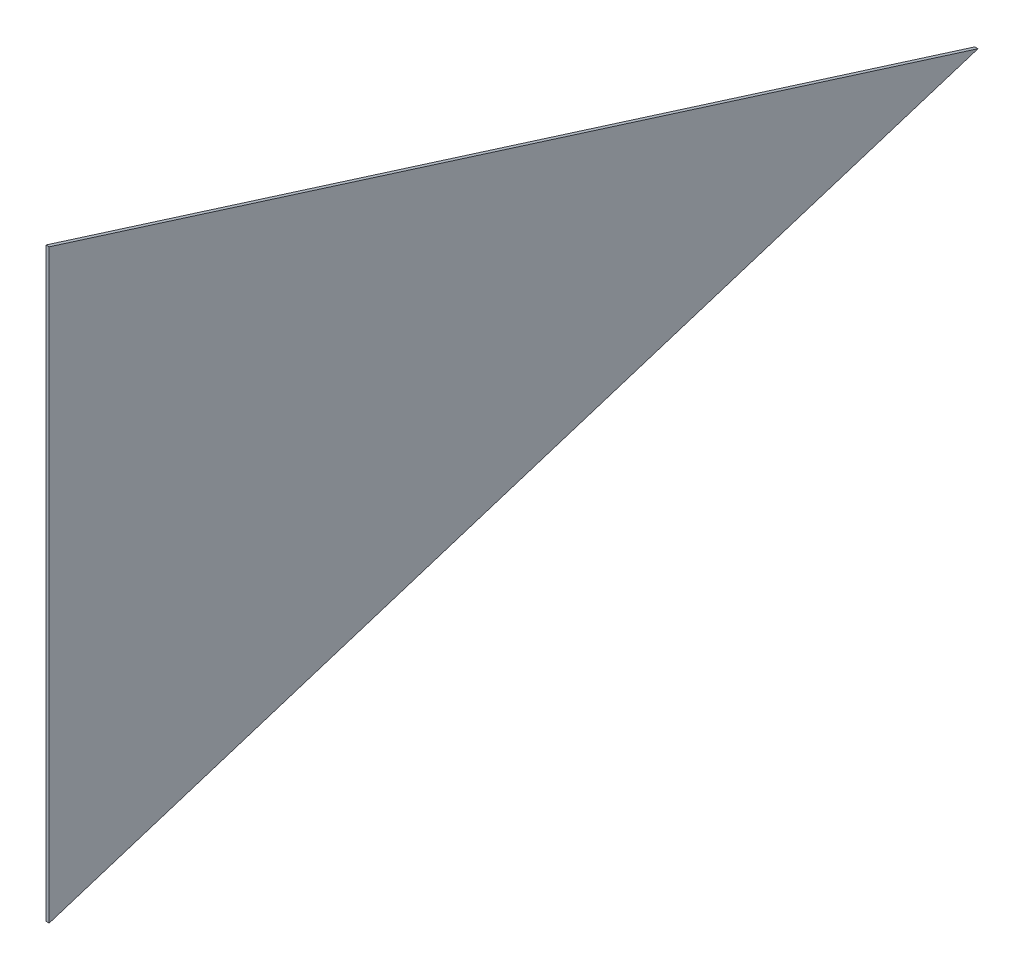
ISO-10303-21;
HEADER;
FILE_DESCRIPTION(('STEP AP214'),'2;1');
FILE_NAME('part.step','',(''),(''),'','','');
FILE_SCHEMA(('AUTOMOTIVE_DESIGN { 1 0 10303 214 1 1 1 1 }'));
ENDSEC;
DATA;
#1=APPLICATION_CONTEXT('core data for automotive mechanical design processes');
#2=APPLICATION_PROTOCOL_DEFINITION('international standard','automotive_design',2000,#1);
#3=PRODUCT_CONTEXT('',#1,'mechanical');
#4=PRODUCT('Part','Part','',(#3));
#5=PRODUCT_RELATED_PRODUCT_CATEGORY('part','',(#4));
#6=PRODUCT_DEFINITION_FORMATION('','',#4);
#7=PRODUCT_DEFINITION_CONTEXT('part definition',#1,'design');
#8=PRODUCT_DEFINITION('design','',#6,#7);
#9=PRODUCT_DEFINITION_SHAPE('','',#8);
#10=(LENGTH_UNIT() NAMED_UNIT(*) SI_UNIT(.MILLI.,.METRE.));
#11=(NAMED_UNIT(*) PLANE_ANGLE_UNIT() SI_UNIT($,.RADIAN.));
#12=(NAMED_UNIT(*) SI_UNIT($,.STERADIAN.) SOLID_ANGLE_UNIT());
#13=UNCERTAINTY_MEASURE_WITH_UNIT(LENGTH_MEASURE(1.E-05),#10,'distance_accuracy_value','');
#14=(GEOMETRIC_REPRESENTATION_CONTEXT(3) GLOBAL_UNCERTAINTY_ASSIGNED_CONTEXT((#13)) GLOBAL_UNIT_ASSIGNED_CONTEXT((#10,
#11,#12)) REPRESENTATION_CONTEXT('',''));
#15=CARTESIAN_POINT('',(0.,0.,0.));
#16=DIRECTION('',(0.,0.,1.));
#17=DIRECTION('',(1.,0.,0.));
#18=AXIS2_PLACEMENT_3D('',#15,#16,#17);
#19=CARTESIAN_POINT('',(6.35,580.622719720643,1841.5));
#20=DIRECTION('',(0.,-0.953716950748228,0.30070579950427));
#21=DIRECTION('',(0.,-0.300705799504271,-0.953716950748228));
#22=AXIS2_PLACEMENT_3D('',#19,#20,#21);
#23=PLANE('',#22);
#24=DIRECTION('',(0.,0.30070579950427,0.953716950748228));
#25=VECTOR('',#24,1.);
#26=CARTESIAN_POINT('',(0.,580.622719720643,1841.5));
#27=LINE('',#26,#25);
#28=CARTESIAN_POINT('',(0.,0.,0.));
#29=VERTEX_POINT('',#28);
#30=CARTESIAN_POINT('',(0.,580.622719720643,1841.5));
#31=VERTEX_POINT('',#30);
#32=EDGE_CURVE('E90',#29,#31,#27,.T.);
#33=ORIENTED_EDGE('',*,*,#32,.T.);
#34=DIRECTION('',(-1.,0.,0.));
#35=VECTOR('',#34,1.);
#36=CARTESIAN_POINT('',(6.35,580.622719720643,1841.5));
#37=LINE('',#36,#35);
#38=CARTESIAN_POINT('',(6.35,580.622719720643,1841.5));
#39=VERTEX_POINT('',#38);
#40=EDGE_CURVE('E11',#39,#31,#37,.T.);
#41=ORIENTED_EDGE('',*,*,#40,.F.);
#42=DIRECTION('',(0.,0.30070579950427,0.953716950748228));
#43=VECTOR('',#42,1.);
#44=CARTESIAN_POINT('',(6.35,580.622719720643,1841.5));
#45=LINE('',#44,#43);
#46=CARTESIAN_POINT('',(6.35,0.,0.));
#47=VERTEX_POINT('',#46);
#48=EDGE_CURVE('E83',#47,#39,#45,.T.);
#49=ORIENTED_EDGE('',*,*,#48,.F.);
#50=DIRECTION('',(-1.,0.,0.));
#51=VECTOR('',#50,1.);
#52=CARTESIAN_POINT('',(6.35,0.,0.));
#53=LINE('',#52,#51);
#54=EDGE_CURVE('E91',#47,#29,#53,.T.);
#55=ORIENTED_EDGE('',*,*,#54,.T.);
#56=EDGE_LOOP('',(#33,#41,#49,#55));
#57=FACE_BOUND('',#56,.T.);
#58=ADVANCED_FACE('F43',(#57),#23,.F.);
#59=CARTESIAN_POINT('',(6.35,-580.622719720643,1841.5));
#60=DIRECTION('',(0.,0.,-1.));
#61=DIRECTION('',(-1.,0.,0.));
#62=AXIS2_PLACEMENT_3D('',#59,#60,#61);
#63=PLANE('',#62);
#64=DIRECTION('',(0.,-1.,0.));
#65=VECTOR('',#64,1.);
#66=CARTESIAN_POINT('',(0.,-580.622719720643,1841.5));
#67=LINE('',#66,#65);
#68=CARTESIAN_POINT('',(0.,-580.622719720643,1841.5));
#69=VERTEX_POINT('',#68);
#70=EDGE_CURVE('E71',#31,#69,#67,.T.);
#71=ORIENTED_EDGE('',*,*,#70,.T.);
#72=DIRECTION('',(-1.,0.,0.));
#73=VECTOR('',#72,1.);
#74=CARTESIAN_POINT('',(6.35,-580.622719720643,1841.5));
#75=LINE('',#74,#73);
#76=CARTESIAN_POINT('',(6.35,-580.622719720643,1841.5));
#77=VERTEX_POINT('',#76);
#78=EDGE_CURVE('E51',#77,#69,#75,.T.);
#79=ORIENTED_EDGE('',*,*,#78,.F.);
#80=DIRECTION('',(0.,-1.,0.));
#81=VECTOR('',#80,1.);
#82=CARTESIAN_POINT('',(6.35,-580.622719720643,1841.5));
#83=LINE('',#82,#81);
#84=EDGE_CURVE('E79',#39,#77,#83,.T.);
#85=ORIENTED_EDGE('',*,*,#84,.F.);
#86=ORIENTED_EDGE('',*,*,#40,.T.);
#87=EDGE_LOOP('',(#71,#79,#85,#86));
#88=FACE_BOUND('',#87,.T.);
#89=ADVANCED_FACE('F80',(#88),#63,.F.);
#90=CARTESIAN_POINT('',(6.35,0.,0.));
#91=DIRECTION('',(0.,0.953716950748228,0.30070579950427));
#92=DIRECTION('',(0.,-0.300705799504271,0.953716950748228));
#93=AXIS2_PLACEMENT_3D('',#90,#91,#92);
#94=PLANE('',#93);
#95=DIRECTION('',(0.,0.30070579950427,-0.953716950748228));
#96=VECTOR('',#95,1.);
#97=CARTESIAN_POINT('',(0.,0.,0.));
#98=LINE('',#97,#96);
#99=EDGE_CURVE('E76',#69,#29,#98,.T.);
#100=ORIENTED_EDGE('',*,*,#99,.T.);
#101=ORIENTED_EDGE('',*,*,#54,.F.);
#102=DIRECTION('',(0.,0.30070579950427,-0.953716950748228));
#103=VECTOR('',#102,1.);
#104=CARTESIAN_POINT('',(6.35,0.,0.));
#105=LINE('',#104,#103);
#106=EDGE_CURVE('E59',#77,#47,#105,.T.);
#107=ORIENTED_EDGE('',*,*,#106,.F.);
#108=ORIENTED_EDGE('',*,*,#78,.T.);
#109=EDGE_LOOP('',(#100,#101,#107,#108));
#110=FACE_BOUND('',#109,.T.);
#111=ADVANCED_FACE('F98',(#110),#94,.F.);
#112=CARTESIAN_POINT('',(6.35,0.,0.));
#113=DIRECTION('',(1.,0.,0.));
#114=DIRECTION('',(0.,0.,-1.));
#115=AXIS2_PLACEMENT_3D('',#112,#113,#114);
#116=PLANE('',#115);
#117=ORIENTED_EDGE('',*,*,#48,.T.);
#118=ORIENTED_EDGE('',*,*,#84,.T.);
#119=ORIENTED_EDGE('',*,*,#106,.T.);
#120=EDGE_LOOP('',(#117,#118,#119));
#121=FACE_BOUND('',#120,.T.);
#122=ADVANCED_FACE('F86',(#121),#116,.T.);
#123=CARTESIAN_POINT('',(0.,0.,0.));
#124=DIRECTION('',(1.,0.,0.));
#125=DIRECTION('',(0.,0.,-1.));
#126=AXIS2_PLACEMENT_3D('',#123,#124,#125);
#127=PLANE('',#126);
#128=ORIENTED_EDGE('',*,*,#32,.F.);
#129=ORIENTED_EDGE('',*,*,#99,.F.);
#130=ORIENTED_EDGE('',*,*,#70,.F.);
#131=EDGE_LOOP('',(#128,#129,#130));
#132=FACE_BOUND('',#131,.T.);
#133=ADVANCED_FACE('F99',(#132),#127,.F.);
#134=CLOSED_SHELL('',(#58,#89,#111,#122,#133));
#135=MANIFOLD_SOLID_BREP('B2',#134);
#136=ADVANCED_BREP_SHAPE_REPRESENTATION('',(#18,#135),#14);
#137=SHAPE_DEFINITION_REPRESENTATION(#9,#136);
ENDSEC;
END-ISO-10303-21;
